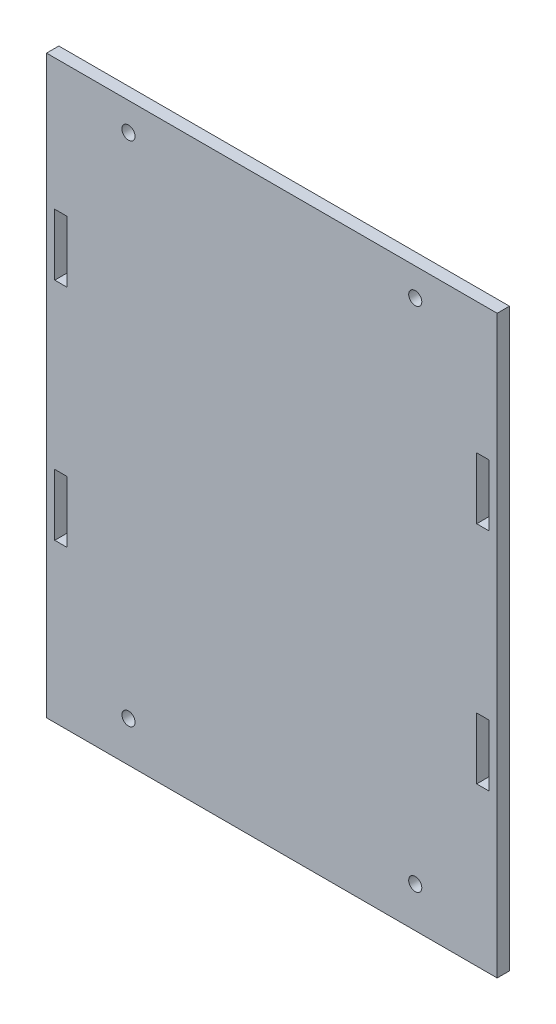
ISO-10303-21;
HEADER;
FILE_DESCRIPTION(('STEP AP214'),'2;1');
FILE_NAME('part.step','',(''),(''),'','','');
FILE_SCHEMA(('AUTOMOTIVE_DESIGN { 1 0 10303 214 1 1 1 1 }'));
ENDSEC;
DATA;
#1=APPLICATION_CONTEXT('core data for automotive mechanical design processes');
#2=APPLICATION_PROTOCOL_DEFINITION('international standard','automotive_design',2000,#1);
#3=PRODUCT_CONTEXT('',#1,'mechanical');
#4=PRODUCT('Part','Part','',(#3));
#5=PRODUCT_RELATED_PRODUCT_CATEGORY('part','',(#4));
#6=PRODUCT_DEFINITION_FORMATION('','',#4);
#7=PRODUCT_DEFINITION_CONTEXT('part definition',#1,'design');
#8=PRODUCT_DEFINITION('design','',#6,#7);
#9=PRODUCT_DEFINITION_SHAPE('','',#8);
#10=(LENGTH_UNIT() NAMED_UNIT(*) SI_UNIT(.MILLI.,.METRE.));
#11=(NAMED_UNIT(*) PLANE_ANGLE_UNIT() SI_UNIT($,.RADIAN.));
#12=(NAMED_UNIT(*) SI_UNIT($,.STERADIAN.) SOLID_ANGLE_UNIT());
#13=UNCERTAINTY_MEASURE_WITH_UNIT(LENGTH_MEASURE(1.E-05),#10,'distance_accuracy_value','');
#14=(GEOMETRIC_REPRESENTATION_CONTEXT(3) GLOBAL_UNCERTAINTY_ASSIGNED_CONTEXT((#13)) GLOBAL_UNIT_ASSIGNED_CONTEXT((#10,
#11,#12)) REPRESENTATION_CONTEXT('',''));
#15=CARTESIAN_POINT('',(0.,0.,0.));
#16=DIRECTION('',(0.,0.,1.));
#17=DIRECTION('',(1.,0.,0.));
#18=AXIS2_PLACEMENT_3D('',#15,#16,#17);
#19=CARTESIAN_POINT('',(50.,124.666666666667,-3.));
#20=DIRECTION('',(1.,0.,0.));
#21=DIRECTION('',(0.,1.,0.));
#22=AXIS2_PLACEMENT_3D('',#19,#20,#21);
#23=PLANE('',#22);
#24=DIRECTION('',(0.,0.,1.));
#25=VECTOR('',#24,1.);
#26=CARTESIAN_POINT('',(50.,92.6666666666667,-143.622252071917));
#27=LINE('',#26,#25);
#28=CARTESIAN_POINT('',(50.,92.6666666666667,-3.));
#29=VERTEX_POINT('',#28);
#30=CARTESIAN_POINT('',(50.,92.6666666666667,0.));
#31=VERTEX_POINT('',#30);
#32=EDGE_CURVE('E212',#29,#31,#27,.T.);
#33=ORIENTED_EDGE('',*,*,#32,.T.);
#34=DIRECTION('',(0.,1.,0.));
#35=VECTOR('',#34,1.);
#36=CARTESIAN_POINT('',(50.,124.666666666667,0.));
#37=LINE('',#36,#35);
#38=CARTESIAN_POINT('',(50.,77.6666666666667,0.));
#39=VERTEX_POINT('',#38);
#40=EDGE_CURVE('E333',#39,#31,#37,.T.);
#41=ORIENTED_EDGE('',*,*,#40,.F.);
#42=DIRECTION('',(0.,0.,1.));
#43=VECTOR('',#42,1.);
#44=CARTESIAN_POINT('',(50.,77.6666666666667,-143.622252071917));
#45=LINE('',#44,#43);
#46=CARTESIAN_POINT('',(50.,77.6666666666667,-3.));
#47=VERTEX_POINT('',#46);
#48=EDGE_CURVE('E223',#47,#39,#45,.T.);
#49=ORIENTED_EDGE('',*,*,#48,.F.);
#50=DIRECTION('',(0.,1.,0.));
#51=VECTOR('',#50,1.);
#52=CARTESIAN_POINT('',(50.,124.666666666667,-3.));
#53=LINE('',#52,#51);
#54=EDGE_CURVE('E336',#47,#29,#53,.T.);
#55=ORIENTED_EDGE('',*,*,#54,.T.);
#56=EDGE_LOOP('',(#33,#41,#49,#55));
#57=FACE_BOUND('',#56,.T.);
#58=ADVANCED_FACE('F37',(#57),#23,.T.);
#59=CARTESIAN_POINT('',(-50.,-15.8666666666667,-3.));
#60=DIRECTION('',(-1.,0.,0.));
#61=DIRECTION('',(0.,-1.,0.));
#62=AXIS2_PLACEMENT_3D('',#59,#60,#61);
#63=PLANE('',#62);
#64=DIRECTION('',(0.,-1.,0.));
#65=VECTOR('',#64,1.);
#66=CARTESIAN_POINT('',(-50.,-15.8666666666667,-3.));
#67=LINE('',#66,#65);
#68=CARTESIAN_POINT('',(-50.,37.6666666666667,-3.));
#69=VERTEX_POINT('',#68);
#70=CARTESIAN_POINT('',(-50.,22.6666666666667,-3.));
#71=VERTEX_POINT('',#70);
#72=EDGE_CURVE('E342',#69,#71,#67,.T.);
#73=ORIENTED_EDGE('',*,*,#72,.T.);
#74=DIRECTION('',(0.,0.,1.));
#75=VECTOR('',#74,1.);
#76=CARTESIAN_POINT('',(-50.,22.6666666666667,-143.622252071917));
#77=LINE('',#76,#75);
#78=CARTESIAN_POINT('',(-50.,22.6666666666667,0.));
#79=VERTEX_POINT('',#78);
#80=EDGE_CURVE('E272',#71,#79,#77,.T.);
#81=ORIENTED_EDGE('',*,*,#80,.T.);
#82=DIRECTION('',(0.,-1.,0.));
#83=VECTOR('',#82,1.);
#84=CARTESIAN_POINT('',(-50.,-15.8666666666667,0.));
#85=LINE('',#84,#83);
#86=CARTESIAN_POINT('',(-50.,37.6666666666667,0.));
#87=VERTEX_POINT('',#86);
#88=EDGE_CURVE('E348',#87,#79,#85,.T.);
#89=ORIENTED_EDGE('',*,*,#88,.F.);
#90=DIRECTION('',(0.,0.,1.));
#91=VECTOR('',#90,1.);
#92=CARTESIAN_POINT('',(-50.,37.6666666666667,-143.622252071917));
#93=LINE('',#92,#91);
#94=EDGE_CURVE('E267',#69,#87,#93,.T.);
#95=ORIENTED_EDGE('',*,*,#94,.F.);
#96=EDGE_LOOP('',(#73,#81,#89,#95));
#97=FACE_BOUND('',#96,.T.);
#98=ADVANCED_FACE('F398',(#97),#63,.T.);
#99=CARTESIAN_POINT('',(-50.,92.6666666666667,0.));
#100=VERTEX_POINT('',#99);
#101=CARTESIAN_POINT('',(-50.,77.6666666666667,0.));
#102=VERTEX_POINT('',#101);
#103=EDGE_CURVE('E350',#100,#102,#85,.T.);
#104=ORIENTED_EDGE('',*,*,#103,.F.);
#105=DIRECTION('',(0.,0.,1.));
#106=VECTOR('',#105,1.);
#107=CARTESIAN_POINT('',(-50.,92.6666666666667,-143.622252071917));
#108=LINE('',#107,#106);
#109=CARTESIAN_POINT('',(-50.,92.6666666666667,-3.));
#110=VERTEX_POINT('',#109);
#111=EDGE_CURVE('E255',#110,#100,#108,.T.);
#112=ORIENTED_EDGE('',*,*,#111,.F.);
#113=CARTESIAN_POINT('',(-50.,77.6666666666667,-3.));
#114=VERTEX_POINT('',#113);
#115=EDGE_CURVE('E46',#110,#114,#67,.T.);
#116=ORIENTED_EDGE('',*,*,#115,.T.);
#117=DIRECTION('',(0.,0.,1.));
#118=VECTOR('',#117,1.);
#119=CARTESIAN_POINT('',(-50.,77.6666666666667,-143.622252071917));
#120=LINE('',#119,#118);
#121=EDGE_CURVE('E262',#114,#102,#120,.T.);
#122=ORIENTED_EDGE('',*,*,#121,.T.);
#123=EDGE_LOOP('',(#104,#112,#116,#122));
#124=FACE_BOUND('',#123,.T.);
#125=ADVANCED_FACE('F420',(#124),#63,.T.);
#126=DIRECTION('',(0.,0.,1.));
#127=VECTOR('',#126,1.);
#128=CARTESIAN_POINT('',(50.,37.6666666666667,-143.622252071917));
#129=LINE('',#128,#127);
#130=CARTESIAN_POINT('',(50.,37.6666666666667,-3.));
#131=VERTEX_POINT('',#130);
#132=CARTESIAN_POINT('',(50.,37.6666666666667,0.));
#133=VERTEX_POINT('',#132);
#134=EDGE_CURVE('E220',#131,#133,#129,.T.);
#135=ORIENTED_EDGE('',*,*,#134,.T.);
#136=CARTESIAN_POINT('',(50.,22.6666666666667,0.));
#137=VERTEX_POINT('',#136);
#138=EDGE_CURVE('E346',#137,#133,#37,.T.);
#139=ORIENTED_EDGE('',*,*,#138,.F.);
#140=DIRECTION('',(0.,0.,1.));
#141=VECTOR('',#140,1.);
#142=CARTESIAN_POINT('',(50.,22.6666666666667,-143.622252071917));
#143=LINE('',#142,#141);
#144=CARTESIAN_POINT('',(50.,22.6666666666667,-3.));
#145=VERTEX_POINT('',#144);
#146=EDGE_CURVE('E190',#145,#137,#143,.T.);
#147=ORIENTED_EDGE('',*,*,#146,.F.);
#148=EDGE_CURVE('E339',#145,#131,#53,.T.);
#149=ORIENTED_EDGE('',*,*,#148,.T.);
#150=EDGE_LOOP('',(#135,#139,#147,#149));
#151=FACE_BOUND('',#150,.T.);
#152=ADVANCED_FACE('F39',(#151),#23,.T.);
#153=CARTESIAN_POINT('',(50.,-15.8666666666667,-3.));
#154=DIRECTION('',(0.,-1.,0.));
#155=DIRECTION('',(1.,0.,0.));
#156=AXIS2_PLACEMENT_3D('',#153,#154,#155);
#157=PLANE('',#156);
#158=DIRECTION('',(1.,0.,0.));
#159=VECTOR('',#158,1.);
#160=CARTESIAN_POINT('',(50.,-15.8666666666667,0.));
#161=LINE('',#160,#159);
#162=CARTESIAN_POINT('',(-55.,-15.8666666666667,0.));
#163=VERTEX_POINT('',#162);
#164=CARTESIAN_POINT('',(55.,-15.8666666666667,0.));
#165=VERTEX_POINT('',#164);
#166=EDGE_CURVE('E41',#163,#165,#161,.T.);
#167=ORIENTED_EDGE('',*,*,#166,.F.);
#168=DIRECTION('',(0.,0.,1.));
#169=VECTOR('',#168,1.);
#170=CARTESIAN_POINT('',(-55.,-15.8666666666667,-143.622252071917));
#171=LINE('',#170,#169);
#172=CARTESIAN_POINT('',(-55.,-15.8666666666667,-3.));
#173=VERTEX_POINT('',#172);
#174=EDGE_CURVE('E290',#173,#163,#171,.T.);
#175=ORIENTED_EDGE('',*,*,#174,.F.);
#176=DIRECTION('',(1.,0.,0.));
#177=VECTOR('',#176,1.);
#178=CARTESIAN_POINT('',(50.,-15.8666666666667,-3.));
#179=LINE('',#178,#177);
#180=CARTESIAN_POINT('',(55.,-15.8666666666667,-3.));
#181=VERTEX_POINT('',#180);
#182=EDGE_CURVE('E11',#173,#181,#179,.T.);
#183=ORIENTED_EDGE('',*,*,#182,.T.);
#184=DIRECTION('',(0.,0.,1.));
#185=VECTOR('',#184,1.);
#186=CARTESIAN_POINT('',(55.,-15.8666666666667,-143.622252071917));
#187=LINE('',#186,#185);
#188=EDGE_CURVE('E198',#181,#165,#187,.T.);
#189=ORIENTED_EDGE('',*,*,#188,.T.);
#190=EDGE_LOOP('',(#167,#175,#183,#189));
#191=FACE_BOUND('',#190,.T.);
#192=ADVANCED_FACE('F364',(#191),#157,.T.);
#193=CARTESIAN_POINT('',(50.,124.666666666667,-3.));
#194=DIRECTION('',(0.,1.,0.));
#195=DIRECTION('',(-1.,0.,0.));
#196=AXIS2_PLACEMENT_3D('',#193,#194,#195);
#197=PLANE('',#196);
#198=DIRECTION('',(-1.,0.,0.));
#199=VECTOR('',#198,1.);
#200=CARTESIAN_POINT('',(50.,124.666666666667,0.));
#201=LINE('',#200,#199);
#202=CARTESIAN_POINT('',(55.,124.666666666667,0.));
#203=VERTEX_POINT('',#202);
#204=CARTESIAN_POINT('',(-55.,124.666666666667,0.));
#205=VERTEX_POINT('',#204);
#206=EDGE_CURVE('E347',#203,#205,#201,.T.);
#207=ORIENTED_EDGE('',*,*,#206,.F.);
#208=DIRECTION('',(0.,0.,1.));
#209=VECTOR('',#208,1.);
#210=CARTESIAN_POINT('',(55.,124.666666666667,-143.622252071917));
#211=LINE('',#210,#209);
#212=CARTESIAN_POINT('',(55.,124.666666666667,-3.));
#213=VERTEX_POINT('',#212);
#214=EDGE_CURVE('E201',#213,#203,#211,.T.);
#215=ORIENTED_EDGE('',*,*,#214,.F.);
#216=DIRECTION('',(-1.,0.,0.));
#217=VECTOR('',#216,1.);
#218=CARTESIAN_POINT('',(50.,124.666666666667,-3.));
#219=LINE('',#218,#217);
#220=CARTESIAN_POINT('',(-55.,124.666666666667,-3.));
#221=VERTEX_POINT('',#220);
#222=EDGE_CURVE('E340',#213,#221,#219,.T.);
#223=ORIENTED_EDGE('',*,*,#222,.T.);
#224=DIRECTION('',(0.,0.,1.));
#225=VECTOR('',#224,1.);
#226=CARTESIAN_POINT('',(-55.,124.666666666667,-143.622252071917));
#227=LINE('',#226,#225);
#228=EDGE_CURVE('E299',#221,#205,#227,.T.);
#229=ORIENTED_EDGE('',*,*,#228,.T.);
#230=EDGE_LOOP('',(#207,#215,#223,#229));
#231=FACE_BOUND('',#230,.T.);
#232=ADVANCED_FACE('F370',(#231),#197,.T.);
#233=CARTESIAN_POINT('',(0.,0.,-3.));
#234=DIRECTION('',(0.,0.,-1.));
#235=DIRECTION('',(-1.,0.,0.));
#236=AXIS2_PLACEMENT_3D('',#233,#234,#235);
#237=PLANE('',#236);
#238=ORIENTED_EDGE('',*,*,#148,.F.);
#239=DIRECTION('',(-1.,0.,0.));
#240=VECTOR('',#239,1.);
#241=CARTESIAN_POINT('',(0.,22.6666666666667,-3.));
#242=LINE('',#241,#240);
#243=CARTESIAN_POINT('',(53.,22.6666666666667,-3.));
#244=VERTEX_POINT('',#243);
#245=EDGE_CURVE('E186',#244,#145,#242,.T.);
#246=ORIENTED_EDGE('',*,*,#245,.F.);
#247=DIRECTION('',(0.,-1.,0.));
#248=VECTOR('',#247,1.);
#249=CARTESIAN_POINT('',(53.,0.,-3.));
#250=LINE('',#249,#248);
#251=CARTESIAN_POINT('',(53.,37.6666666666667,-3.));
#252=VERTEX_POINT('',#251);
#253=EDGE_CURVE('E184',#252,#244,#250,.T.);
#254=ORIENTED_EDGE('',*,*,#253,.F.);
#255=DIRECTION('',(1.,0.,0.));
#256=VECTOR('',#255,1.);
#257=CARTESIAN_POINT('',(0.,37.6666666666667,-3.));
#258=LINE('',#257,#256);
#259=EDGE_CURVE('E217',#131,#252,#258,.T.);
#260=ORIENTED_EDGE('',*,*,#259,.F.);
#261=EDGE_LOOP('',(#238,#246,#254,#260));
#262=FACE_BOUND('',#261,.T.);
#263=DIRECTION('',(1.,0.,0.));
#264=VECTOR('',#263,1.);
#265=CARTESIAN_POINT('',(0.,92.6666666666667,-3.));
#266=LINE('',#265,#264);
#267=CARTESIAN_POINT('',(53.,92.6666666666667,-3.));
#268=VERTEX_POINT('',#267);
#269=EDGE_CURVE('E229',#29,#268,#266,.T.);
#270=ORIENTED_EDGE('',*,*,#269,.F.);
#271=ORIENTED_EDGE('',*,*,#54,.F.);
#272=DIRECTION('',(-1.,0.,0.));
#273=VECTOR('',#272,1.);
#274=CARTESIAN_POINT('',(0.,77.6666666666667,-3.));
#275=LINE('',#274,#273);
#276=CARTESIAN_POINT('',(53.,77.6666666666667,-3.));
#277=VERTEX_POINT('',#276);
#278=EDGE_CURVE('E221',#277,#47,#275,.T.);
#279=ORIENTED_EDGE('',*,*,#278,.F.);
#280=DIRECTION('',(0.,-1.,0.));
#281=VECTOR('',#280,1.);
#282=CARTESIAN_POINT('',(53.,0.,-3.));
#283=LINE('',#282,#281);
#284=EDGE_CURVE('E225',#268,#277,#283,.T.);
#285=ORIENTED_EDGE('',*,*,#284,.F.);
#286=EDGE_LOOP('',(#270,#271,#279,#285));
#287=FACE_BOUND('',#286,.T.);
#288=ORIENTED_EDGE('',*,*,#182,.F.);
#289=DIRECTION('',(0.,-1.,0.));
#290=VECTOR('',#289,1.);
#291=CARTESIAN_POINT('',(-55.,0.,-3.));
#292=LINE('',#291,#290);
#293=EDGE_CURVE('E287',#221,#173,#292,.T.);
#294=ORIENTED_EDGE('',*,*,#293,.F.);
#295=ORIENTED_EDGE('',*,*,#222,.F.);
#296=DIRECTION('',(0.,-1.,0.));
#297=VECTOR('',#296,1.);
#298=CARTESIAN_POINT('',(55.,0.,-3.));
#299=LINE('',#298,#297);
#300=EDGE_CURVE('E193',#213,#181,#299,.T.);
#301=ORIENTED_EDGE('',*,*,#300,.T.);
#302=EDGE_LOOP('',(#288,#294,#295,#301));
#303=FACE_BOUND('',#302,.T.);
#304=ORIENTED_EDGE('',*,*,#115,.F.);
#305=DIRECTION('',(-1.,0.,0.));
#306=VECTOR('',#305,1.);
#307=CARTESIAN_POINT('',(0.,92.6666666666667,-3.));
#308=LINE('',#307,#306);
#309=CARTESIAN_POINT('',(-53.,92.6666666666667,-3.));
#310=VERTEX_POINT('',#309);
#311=EDGE_CURVE('E283',#110,#310,#308,.T.);
#312=ORIENTED_EDGE('',*,*,#311,.T.);
#313=DIRECTION('',(0.,-1.,0.));
#314=VECTOR('',#313,1.);
#315=CARTESIAN_POINT('',(-53.,0.,-3.));
#316=LINE('',#315,#314);
#317=CARTESIAN_POINT('',(-53.,77.6666666666667,-3.));
#318=VERTEX_POINT('',#317);
#319=EDGE_CURVE('E280',#310,#318,#316,.T.);
#320=ORIENTED_EDGE('',*,*,#319,.T.);
#321=DIRECTION('',(1.,0.,0.));
#322=VECTOR('',#321,1.);
#323=CARTESIAN_POINT('',(0.,77.6666666666667,-3.));
#324=LINE('',#323,#322);
#325=EDGE_CURVE('E277',#318,#114,#324,.T.);
#326=ORIENTED_EDGE('',*,*,#325,.T.);
#327=EDGE_LOOP('',(#304,#312,#320,#326));
#328=FACE_BOUND('',#327,.T.);
#329=CARTESIAN_POINT('',(35.,117.866666666667,-3.));
#330=DIRECTION('',(0.,0.,1.));
#331=DIRECTION('',(1.,0.,0.));
#332=AXIS2_PLACEMENT_3D('',#329,#330,#331);
#333=CIRCLE('',#332,1.6);
#334=CARTESIAN_POINT('',(36.6,117.866666666667,-3.));
#335=VERTEX_POINT('',#334);
#336=EDGE_CURVE('E312',#335,#335,#333,.T.);
#337=ORIENTED_EDGE('',*,*,#336,.T.);
#338=EDGE_LOOP('',(#337));
#339=FACE_BOUND('',#338,.T.);
#340=CARTESIAN_POINT('',(-35.,117.866666666667,-3.));
#341=DIRECTION('',(0.,0.,1.));
#342=DIRECTION('',(1.,0.,0.));
#343=AXIS2_PLACEMENT_3D('',#340,#341,#342);
#344=CIRCLE('',#343,1.6);
#345=CARTESIAN_POINT('',(-33.4,117.866666666667,-3.));
#346=VERTEX_POINT('',#345);
#347=EDGE_CURVE('E318',#346,#346,#344,.T.);
#348=ORIENTED_EDGE('',*,*,#347,.T.);
#349=EDGE_LOOP('',(#348));
#350=FACE_BOUND('',#349,.T.);
#351=CARTESIAN_POINT('',(35.,-6.,-3.));
#352=DIRECTION('',(0.,0.,1.));
#353=DIRECTION('',(1.,0.,0.));
#354=AXIS2_PLACEMENT_3D('',#351,#352,#353);
#355=CIRCLE('',#354,1.6);
#356=CARTESIAN_POINT('',(36.6,-6.,-3.));
#357=VERTEX_POINT('',#356);
#358=EDGE_CURVE('E324',#357,#357,#355,.T.);
#359=ORIENTED_EDGE('',*,*,#358,.T.);
#360=EDGE_LOOP('',(#359));
#361=FACE_BOUND('',#360,.T.);
#362=CARTESIAN_POINT('',(-35.,-6.,-3.));
#363=DIRECTION('',(0.,0.,1.));
#364=DIRECTION('',(1.,0.,0.));
#365=AXIS2_PLACEMENT_3D('',#362,#363,#364);
#366=CIRCLE('',#365,1.6);
#367=CARTESIAN_POINT('',(-33.4,-6.,-3.));
#368=VERTEX_POINT('',#367);
#369=EDGE_CURVE('E330',#368,#368,#366,.T.);
#370=ORIENTED_EDGE('',*,*,#369,.T.);
#371=EDGE_LOOP('',(#370));
#372=FACE_BOUND('',#371,.T.);
#373=DIRECTION('',(1.,0.,0.));
#374=VECTOR('',#373,1.);
#375=CARTESIAN_POINT('',(0.,22.6666666666667,-3.));
#376=LINE('',#375,#374);
#377=CARTESIAN_POINT('',(-53.,22.6666666666667,-3.));
#378=VERTEX_POINT('',#377);
#379=EDGE_CURVE('E286',#378,#71,#376,.T.);
#380=ORIENTED_EDGE('',*,*,#379,.T.);
#381=ORIENTED_EDGE('',*,*,#72,.F.);
#382=DIRECTION('',(-1.,0.,0.));
#383=VECTOR('',#382,1.);
#384=CARTESIAN_POINT('',(0.,37.6666666666667,-3.));
#385=LINE('',#384,#383);
#386=CARTESIAN_POINT('',(-53.,37.6666666666667,-3.));
#387=VERTEX_POINT('',#386);
#388=EDGE_CURVE('E273',#69,#387,#385,.T.);
#389=ORIENTED_EDGE('',*,*,#388,.T.);
#390=DIRECTION('',(0.,-1.,0.));
#391=VECTOR('',#390,1.);
#392=CARTESIAN_POINT('',(-53.,0.,-3.));
#393=LINE('',#392,#391);
#394=EDGE_CURVE('E249',#387,#378,#393,.T.);
#395=ORIENTED_EDGE('',*,*,#394,.T.);
#396=EDGE_LOOP('',(#380,#381,#389,#395));
#397=FACE_BOUND('',#396,.T.);
#398=ADVANCED_FACE('F376',(#262,#287,#303,#328,#339,#350,#361,#372,#397),#237,.T.);
#399=CARTESIAN_POINT('',(0.,0.,0.));
#400=DIRECTION('',(0.,0.,-1.));
#401=DIRECTION('',(-1.,0.,0.));
#402=AXIS2_PLACEMENT_3D('',#399,#400,#401);
#403=PLANE('',#402);
#404=DIRECTION('',(-1.,0.,0.));
#405=VECTOR('',#404,1.);
#406=CARTESIAN_POINT('',(0.,22.6666666666667,0.));
#407=LINE('',#406,#405);
#408=CARTESIAN_POINT('',(53.,22.6666666666667,0.));
#409=VERTEX_POINT('',#408);
#410=EDGE_CURVE('E62',#409,#137,#407,.T.);
#411=ORIENTED_EDGE('',*,*,#410,.T.);
#412=ORIENTED_EDGE('',*,*,#138,.T.);
#413=DIRECTION('',(1.,0.,0.));
#414=VECTOR('',#413,1.);
#415=CARTESIAN_POINT('',(0.,37.6666666666667,0.));
#416=LINE('',#415,#414);
#417=CARTESIAN_POINT('',(53.,37.6666666666667,0.));
#418=VERTEX_POINT('',#417);
#419=EDGE_CURVE('E197',#133,#418,#416,.T.);
#420=ORIENTED_EDGE('',*,*,#419,.T.);
#421=DIRECTION('',(0.,-1.,0.));
#422=VECTOR('',#421,1.);
#423=CARTESIAN_POINT('',(53.,0.,0.));
#424=LINE('',#423,#422);
#425=EDGE_CURVE('E183',#418,#409,#424,.T.);
#426=ORIENTED_EDGE('',*,*,#425,.T.);
#427=EDGE_LOOP('',(#411,#412,#420,#426));
#428=FACE_BOUND('',#427,.T.);
#429=ORIENTED_EDGE('',*,*,#40,.T.);
#430=DIRECTION('',(1.,0.,0.));
#431=VECTOR('',#430,1.);
#432=CARTESIAN_POINT('',(0.,92.6666666666667,0.));
#433=LINE('',#432,#431);
#434=CARTESIAN_POINT('',(53.,92.6666666666667,0.));
#435=VERTEX_POINT('',#434);
#436=EDGE_CURVE('E192',#31,#435,#433,.T.);
#437=ORIENTED_EDGE('',*,*,#436,.T.);
#438=DIRECTION('',(0.,-1.,0.));
#439=VECTOR('',#438,1.);
#440=CARTESIAN_POINT('',(53.,0.,0.));
#441=LINE('',#440,#439);
#442=CARTESIAN_POINT('',(53.,77.6666666666667,0.));
#443=VERTEX_POINT('',#442);
#444=EDGE_CURVE('E206',#435,#443,#441,.T.);
#445=ORIENTED_EDGE('',*,*,#444,.T.);
#446=DIRECTION('',(-1.,0.,0.));
#447=VECTOR('',#446,1.);
#448=CARTESIAN_POINT('',(0.,77.6666666666667,0.));
#449=LINE('',#448,#447);
#450=EDGE_CURVE('E54',#443,#39,#449,.T.);
#451=ORIENTED_EDGE('',*,*,#450,.T.);
#452=EDGE_LOOP('',(#429,#437,#445,#451));
#453=FACE_BOUND('',#452,.T.);
#454=DIRECTION('',(0.,-1.,0.));
#455=VECTOR('',#454,1.);
#456=CARTESIAN_POINT('',(-55.,0.,0.));
#457=LINE('',#456,#455);
#458=EDGE_CURVE('E246',#205,#163,#457,.T.);
#459=ORIENTED_EDGE('',*,*,#458,.T.);
#460=ORIENTED_EDGE('',*,*,#166,.T.);
#461=DIRECTION('',(0.,-1.,0.));
#462=VECTOR('',#461,1.);
#463=CARTESIAN_POINT('',(55.,0.,0.));
#464=LINE('',#463,#462);
#465=EDGE_CURVE('E210',#203,#165,#464,.T.);
#466=ORIENTED_EDGE('',*,*,#465,.F.);
#467=ORIENTED_EDGE('',*,*,#206,.T.);
#468=EDGE_LOOP('',(#459,#460,#466,#467));
#469=FACE_BOUND('',#468,.T.);
#470=DIRECTION('',(-1.,0.,0.));
#471=VECTOR('',#470,1.);
#472=CARTESIAN_POINT('',(0.,92.6666666666667,0.));
#473=LINE('',#472,#471);
#474=CARTESIAN_POINT('',(-53.,92.6666666666667,0.));
#475=VERTEX_POINT('',#474);
#476=EDGE_CURVE('E251',#100,#475,#473,.T.);
#477=ORIENTED_EDGE('',*,*,#476,.F.);
#478=ORIENTED_EDGE('',*,*,#103,.T.);
#479=DIRECTION('',(1.,0.,0.));
#480=VECTOR('',#479,1.);
#481=CARTESIAN_POINT('',(0.,77.6666666666667,0.));
#482=LINE('',#481,#480);
#483=CARTESIAN_POINT('',(-53.,77.6666666666667,0.));
#484=VERTEX_POINT('',#483);
#485=EDGE_CURVE('E260',#484,#102,#482,.T.);
#486=ORIENTED_EDGE('',*,*,#485,.F.);
#487=DIRECTION('',(0.,-1.,0.));
#488=VECTOR('',#487,1.);
#489=CARTESIAN_POINT('',(-53.,0.,0.));
#490=LINE('',#489,#488);
#491=EDGE_CURVE('E256',#475,#484,#490,.T.);
#492=ORIENTED_EDGE('',*,*,#491,.F.);
#493=EDGE_LOOP('',(#477,#478,#486,#492));
#494=FACE_BOUND('',#493,.T.);
#495=CARTESIAN_POINT('',(35.,117.866666666667,0.));
#496=DIRECTION('',(0.,0.,1.));
#497=DIRECTION('',(1.,0.,0.));
#498=AXIS2_PLACEMENT_3D('',#495,#496,#497);
#499=CIRCLE('',#498,1.6);
#500=CARTESIAN_POINT('',(36.6,117.866666666667,0.));
#501=VERTEX_POINT('',#500);
#502=EDGE_CURVE('E276',#501,#501,#499,.T.);
#503=ORIENTED_EDGE('',*,*,#502,.F.);
#504=EDGE_LOOP('',(#503));
#505=FACE_BOUND('',#504,.T.);
#506=CARTESIAN_POINT('',(-35.,117.866666666667,0.));
#507=DIRECTION('',(0.,0.,1.));
#508=DIRECTION('',(1.,0.,0.));
#509=AXIS2_PLACEMENT_3D('',#506,#507,#508);
#510=CIRCLE('',#509,1.6);
#511=CARTESIAN_POINT('',(-33.4,117.866666666667,0.));
#512=VERTEX_POINT('',#511);
#513=EDGE_CURVE('E315',#512,#512,#510,.T.);
#514=ORIENTED_EDGE('',*,*,#513,.F.);
#515=EDGE_LOOP('',(#514));
#516=FACE_BOUND('',#515,.T.);
#517=CARTESIAN_POINT('',(35.,-6.,0.));
#518=DIRECTION('',(0.,0.,1.));
#519=DIRECTION('',(1.,0.,0.));
#520=AXIS2_PLACEMENT_3D('',#517,#518,#519);
#521=CIRCLE('',#520,1.6);
#522=CARTESIAN_POINT('',(36.6,-6.,0.));
#523=VERTEX_POINT('',#522);
#524=EDGE_CURVE('E321',#523,#523,#521,.T.);
#525=ORIENTED_EDGE('',*,*,#524,.F.);
#526=EDGE_LOOP('',(#525));
#527=FACE_BOUND('',#526,.T.);
#528=CARTESIAN_POINT('',(-35.,-6.,0.));
#529=DIRECTION('',(0.,0.,1.));
#530=DIRECTION('',(1.,0.,0.));
#531=AXIS2_PLACEMENT_3D('',#528,#529,#530);
#532=CIRCLE('',#531,1.6);
#533=CARTESIAN_POINT('',(-33.4,-6.,0.));
#534=VERTEX_POINT('',#533);
#535=EDGE_CURVE('E327',#534,#534,#532,.T.);
#536=ORIENTED_EDGE('',*,*,#535,.F.);
#537=EDGE_LOOP('',(#536));
#538=FACE_BOUND('',#537,.T.);
#539=ORIENTED_EDGE('',*,*,#88,.T.);
#540=DIRECTION('',(1.,0.,0.));
#541=VECTOR('',#540,1.);
#542=CARTESIAN_POINT('',(0.,22.6666666666667,0.));
#543=LINE('',#542,#541);
#544=CARTESIAN_POINT('',(-53.,22.6666666666667,0.));
#545=VERTEX_POINT('',#544);
#546=EDGE_CURVE('E270',#545,#79,#543,.T.);
#547=ORIENTED_EDGE('',*,*,#546,.F.);
#548=DIRECTION('',(0.,-1.,0.));
#549=VECTOR('',#548,1.);
#550=CARTESIAN_POINT('',(-53.,0.,0.));
#551=LINE('',#550,#549);
#552=CARTESIAN_POINT('',(-53.,37.6666666666667,0.));
#553=VERTEX_POINT('',#552);
#554=EDGE_CURVE('E250',#553,#545,#551,.T.);
#555=ORIENTED_EDGE('',*,*,#554,.F.);
#556=DIRECTION('',(-1.,0.,0.));
#557=VECTOR('',#556,1.);
#558=CARTESIAN_POINT('',(0.,37.6666666666667,0.));
#559=LINE('',#558,#557);
#560=EDGE_CURVE('E263',#87,#553,#559,.T.);
#561=ORIENTED_EDGE('',*,*,#560,.F.);
#562=EDGE_LOOP('',(#539,#547,#555,#561));
#563=FACE_BOUND('',#562,.T.);
#564=ADVANCED_FACE('F196',(#428,#453,#469,#494,#505,#516,#527,#538,#563),#403,.F.);
#565=CARTESIAN_POINT('',(-35.,-6.,-3.));
#566=DIRECTION('',(0.,0.,1.));
#567=DIRECTION('',(1.,0.,0.));
#568=AXIS2_PLACEMENT_3D('',#565,#566,#567);
#569=CYLINDRICAL_SURFACE('',#568,1.6);
#570=ORIENTED_EDGE('',*,*,#369,.F.);
#571=EDGE_LOOP('',(#570));
#572=FACE_BOUND('',#571,.T.);
#573=ORIENTED_EDGE('',*,*,#535,.T.);
#574=EDGE_LOOP('',(#573));
#575=FACE_BOUND('',#574,.T.);
#576=ADVANCED_FACE('F406',(#572,#575),#569,.F.);
#577=CARTESIAN_POINT('',(35.,-6.,-3.));
#578=DIRECTION('',(0.,0.,1.));
#579=DIRECTION('',(1.,0.,0.));
#580=AXIS2_PLACEMENT_3D('',#577,#578,#579);
#581=CYLINDRICAL_SURFACE('',#580,1.6);
#582=ORIENTED_EDGE('',*,*,#358,.F.);
#583=EDGE_LOOP('',(#582));
#584=FACE_BOUND('',#583,.T.);
#585=ORIENTED_EDGE('',*,*,#524,.T.);
#586=EDGE_LOOP('',(#585));
#587=FACE_BOUND('',#586,.T.);
#588=ADVANCED_FACE('F411',(#584,#587),#581,.F.);
#589=CARTESIAN_POINT('',(-35.,117.866666666667,-3.));
#590=DIRECTION('',(0.,0.,1.));
#591=DIRECTION('',(1.,0.,0.));
#592=AXIS2_PLACEMENT_3D('',#589,#590,#591);
#593=CYLINDRICAL_SURFACE('',#592,1.6);
#594=ORIENTED_EDGE('',*,*,#347,.F.);
#595=EDGE_LOOP('',(#594));
#596=FACE_BOUND('',#595,.T.);
#597=ORIENTED_EDGE('',*,*,#513,.T.);
#598=EDGE_LOOP('',(#597));
#599=FACE_BOUND('',#598,.T.);
#600=ADVANCED_FACE('F483',(#596,#599),#593,.F.);
#601=CARTESIAN_POINT('',(35.,117.866666666667,-3.));
#602=DIRECTION('',(0.,0.,1.));
#603=DIRECTION('',(1.,0.,0.));
#604=AXIS2_PLACEMENT_3D('',#601,#602,#603);
#605=CYLINDRICAL_SURFACE('',#604,1.6);
#606=ORIENTED_EDGE('',*,*,#336,.F.);
#607=EDGE_LOOP('',(#606));
#608=FACE_BOUND('',#607,.T.);
#609=ORIENTED_EDGE('',*,*,#502,.T.);
#610=EDGE_LOOP('',(#609));
#611=FACE_BOUND('',#610,.T.);
#612=ADVANCED_FACE('F480',(#608,#611),#605,.F.);
#613=CARTESIAN_POINT('',(0.,22.6666666666667,-143.622252071917));
#614=DIRECTION('',(0.,-1.,0.));
#615=DIRECTION('',(1.,0.,0.));
#616=AXIS2_PLACEMENT_3D('',#613,#614,#615);
#617=PLANE('',#616);
#618=ORIENTED_EDGE('',*,*,#379,.F.);
#619=DIRECTION('',(0.,0.,1.));
#620=VECTOR('',#619,1.);
#621=CARTESIAN_POINT('',(-53.,22.6666666666667,-143.622252071917));
#622=LINE('',#621,#620);
#623=EDGE_CURVE('E245',#378,#545,#622,.T.);
#624=ORIENTED_EDGE('',*,*,#623,.T.);
#625=ORIENTED_EDGE('',*,*,#546,.T.);
#626=ORIENTED_EDGE('',*,*,#80,.F.);
#627=EDGE_LOOP('',(#618,#624,#625,#626));
#628=FACE_BOUND('',#627,.T.);
#629=ADVANCED_FACE('F404',(#628),#617,.F.);
#630=CARTESIAN_POINT('',(-55.,0.,-143.622252071917));
#631=DIRECTION('',(-1.,0.,0.));
#632=DIRECTION('',(0.,-1.,0.));
#633=AXIS2_PLACEMENT_3D('',#630,#631,#632);
#634=PLANE('',#633);
#635=ORIENTED_EDGE('',*,*,#228,.F.);
#636=ORIENTED_EDGE('',*,*,#293,.T.);
#637=ORIENTED_EDGE('',*,*,#174,.T.);
#638=ORIENTED_EDGE('',*,*,#458,.F.);
#639=EDGE_LOOP('',(#635,#636,#637,#638));
#640=FACE_BOUND('',#639,.T.);
#641=ADVANCED_FACE('F374',(#640),#634,.T.);
#642=CARTESIAN_POINT('',(0.,92.6666666666667,-143.622252071917));
#643=DIRECTION('',(0.,1.,0.));
#644=DIRECTION('',(0.,0.,1.));
#645=AXIS2_PLACEMENT_3D('',#642,#643,#644);
#646=PLANE('',#645);
#647=ORIENTED_EDGE('',*,*,#311,.F.);
#648=ORIENTED_EDGE('',*,*,#111,.T.);
#649=ORIENTED_EDGE('',*,*,#476,.T.);
#650=DIRECTION('',(0.,0.,1.));
#651=VECTOR('',#650,1.);
#652=CARTESIAN_POINT('',(-53.,92.6666666666667,-143.622252071917));
#653=LINE('',#652,#651);
#654=EDGE_CURVE('E254',#310,#475,#653,.T.);
#655=ORIENTED_EDGE('',*,*,#654,.F.);
#656=EDGE_LOOP('',(#647,#648,#649,#655));
#657=FACE_BOUND('',#656,.T.);
#658=ADVANCED_FACE('F471',(#657),#646,.F.);
#659=CARTESIAN_POINT('',(-53.,0.,-143.622252071917));
#660=DIRECTION('',(-1.,0.,0.));
#661=DIRECTION('',(0.,0.,1.));
#662=AXIS2_PLACEMENT_3D('',#659,#660,#661);
#663=PLANE('',#662);
#664=ORIENTED_EDGE('',*,*,#319,.F.);
#665=ORIENTED_EDGE('',*,*,#654,.T.);
#666=ORIENTED_EDGE('',*,*,#491,.T.);
#667=DIRECTION('',(0.,0.,1.));
#668=VECTOR('',#667,1.);
#669=CARTESIAN_POINT('',(-53.,77.6666666666667,-143.622252071917));
#670=LINE('',#669,#668);
#671=EDGE_CURVE('E259',#318,#484,#670,.T.);
#672=ORIENTED_EDGE('',*,*,#671,.F.);
#673=EDGE_LOOP('',(#664,#665,#666,#672));
#674=FACE_BOUND('',#673,.T.);
#675=ADVANCED_FACE('F467',(#674),#663,.F.);
#676=CARTESIAN_POINT('',(0.,77.6666666666667,-143.622252071917));
#677=DIRECTION('',(0.,-1.,0.));
#678=DIRECTION('',(0.,0.,-1.));
#679=AXIS2_PLACEMENT_3D('',#676,#677,#678);
#680=PLANE('',#679);
#681=ORIENTED_EDGE('',*,*,#325,.F.);
#682=ORIENTED_EDGE('',*,*,#671,.T.);
#683=ORIENTED_EDGE('',*,*,#485,.T.);
#684=ORIENTED_EDGE('',*,*,#121,.F.);
#685=EDGE_LOOP('',(#681,#682,#683,#684));
#686=FACE_BOUND('',#685,.T.);
#687=ADVANCED_FACE('F464',(#686),#680,.F.);
#688=CARTESIAN_POINT('',(0.,37.6666666666667,-143.622252071917));
#689=DIRECTION('',(0.,1.,0.));
#690=DIRECTION('',(0.,0.,1.));
#691=AXIS2_PLACEMENT_3D('',#688,#689,#690);
#692=PLANE('',#691);
#693=ORIENTED_EDGE('',*,*,#388,.F.);
#694=ORIENTED_EDGE('',*,*,#94,.T.);
#695=ORIENTED_EDGE('',*,*,#560,.T.);
#696=DIRECTION('',(0.,0.,1.));
#697=VECTOR('',#696,1.);
#698=CARTESIAN_POINT('',(-53.,37.6666666666667,-143.622252071917));
#699=LINE('',#698,#697);
#700=EDGE_CURVE('E266',#387,#553,#699,.T.);
#701=ORIENTED_EDGE('',*,*,#700,.F.);
#702=EDGE_LOOP('',(#693,#694,#695,#701));
#703=FACE_BOUND('',#702,.T.);
#704=ADVANCED_FACE('F400',(#703),#692,.F.);
#705=CARTESIAN_POINT('',(-53.,0.,-143.622252071917));
#706=DIRECTION('',(-1.,0.,0.));
#707=DIRECTION('',(0.,0.,1.));
#708=AXIS2_PLACEMENT_3D('',#705,#706,#707);
#709=PLANE('',#708);
#710=ORIENTED_EDGE('',*,*,#394,.F.);
#711=ORIENTED_EDGE('',*,*,#700,.T.);
#712=ORIENTED_EDGE('',*,*,#554,.T.);
#713=ORIENTED_EDGE('',*,*,#623,.F.);
#714=EDGE_LOOP('',(#710,#711,#712,#713));
#715=FACE_BOUND('',#714,.T.);
#716=ADVANCED_FACE('F403',(#715),#709,.F.);
#717=CARTESIAN_POINT('',(55.,0.,-143.622252071917));
#718=DIRECTION('',(-1.,0.,0.));
#719=DIRECTION('',(0.,-1.,0.));
#720=AXIS2_PLACEMENT_3D('',#717,#718,#719);
#721=PLANE('',#720);
#722=ORIENTED_EDGE('',*,*,#300,.F.);
#723=ORIENTED_EDGE('',*,*,#214,.T.);
#724=ORIENTED_EDGE('',*,*,#465,.T.);
#725=ORIENTED_EDGE('',*,*,#188,.F.);
#726=EDGE_LOOP('',(#722,#723,#724,#725));
#727=FACE_BOUND('',#726,.T.);
#728=ADVANCED_FACE('F367',(#727),#721,.F.);
#729=CARTESIAN_POINT('',(0.,92.6666666666667,-143.622252071917));
#730=DIRECTION('',(0.,-1.,0.));
#731=DIRECTION('',(0.,0.,-1.));
#732=AXIS2_PLACEMENT_3D('',#729,#730,#731);
#733=PLANE('',#732);
#734=ORIENTED_EDGE('',*,*,#32,.F.);
#735=ORIENTED_EDGE('',*,*,#269,.T.);
#736=DIRECTION('',(0.,0.,1.));
#737=VECTOR('',#736,1.);
#738=CARTESIAN_POINT('',(53.,92.6666666666667,-143.622252071917));
#739=LINE('',#738,#737);
#740=EDGE_CURVE('E228',#268,#435,#739,.T.);
#741=ORIENTED_EDGE('',*,*,#740,.T.);
#742=ORIENTED_EDGE('',*,*,#436,.F.);
#743=EDGE_LOOP('',(#734,#735,#741,#742));
#744=FACE_BOUND('',#743,.T.);
#745=ADVANCED_FACE('F439',(#744),#733,.T.);
#746=CARTESIAN_POINT('',(53.,0.,-143.622252071917));
#747=DIRECTION('',(-1.,0.,0.));
#748=DIRECTION('',(0.,0.,1.));
#749=AXIS2_PLACEMENT_3D('',#746,#747,#748);
#750=PLANE('',#749);
#751=ORIENTED_EDGE('',*,*,#740,.F.);
#752=ORIENTED_EDGE('',*,*,#284,.T.);
#753=DIRECTION('',(0.,0.,1.));
#754=VECTOR('',#753,1.);
#755=CARTESIAN_POINT('',(53.,77.6666666666667,-143.622252071917));
#756=LINE('',#755,#754);
#757=EDGE_CURVE('E224',#277,#443,#756,.T.);
#758=ORIENTED_EDGE('',*,*,#757,.T.);
#759=ORIENTED_EDGE('',*,*,#444,.F.);
#760=EDGE_LOOP('',(#751,#752,#758,#759));
#761=FACE_BOUND('',#760,.T.);
#762=ADVANCED_FACE('F447',(#761),#750,.T.);
#763=CARTESIAN_POINT('',(0.,77.6666666666667,-143.622252071917));
#764=DIRECTION('',(0.,1.,0.));
#765=DIRECTION('',(0.,0.,1.));
#766=AXIS2_PLACEMENT_3D('',#763,#764,#765);
#767=PLANE('',#766);
#768=ORIENTED_EDGE('',*,*,#757,.F.);
#769=ORIENTED_EDGE('',*,*,#278,.T.);
#770=ORIENTED_EDGE('',*,*,#48,.T.);
#771=ORIENTED_EDGE('',*,*,#450,.F.);
#772=EDGE_LOOP('',(#768,#769,#770,#771));
#773=FACE_BOUND('',#772,.T.);
#774=ADVANCED_FACE('F444',(#773),#767,.T.);
#775=CARTESIAN_POINT('',(0.,37.6666666666667,-143.622252071917));
#776=DIRECTION('',(0.,-1.,0.));
#777=DIRECTION('',(0.,0.,-1.));
#778=AXIS2_PLACEMENT_3D('',#775,#776,#777);
#779=PLANE('',#778);
#780=ORIENTED_EDGE('',*,*,#134,.F.);
#781=ORIENTED_EDGE('',*,*,#259,.T.);
#782=DIRECTION('',(0.,0.,1.));
#783=VECTOR('',#782,1.);
#784=CARTESIAN_POINT('',(53.,37.6666666666667,-143.622252071917));
#785=LINE('',#784,#783);
#786=EDGE_CURVE('E216',#252,#418,#785,.T.);
#787=ORIENTED_EDGE('',*,*,#786,.T.);
#788=ORIENTED_EDGE('',*,*,#419,.F.);
#789=EDGE_LOOP('',(#780,#781,#787,#788));
#790=FACE_BOUND('',#789,.T.);
#791=ADVANCED_FACE('F433',(#790),#779,.T.);
#792=CARTESIAN_POINT('',(53.,0.,-143.622252071917));
#793=DIRECTION('',(-1.,0.,0.));
#794=DIRECTION('',(0.,0.,1.));
#795=AXIS2_PLACEMENT_3D('',#792,#793,#794);
#796=PLANE('',#795);
#797=ORIENTED_EDGE('',*,*,#786,.F.);
#798=ORIENTED_EDGE('',*,*,#253,.T.);
#799=DIRECTION('',(0.,0.,1.));
#800=VECTOR('',#799,1.);
#801=CARTESIAN_POINT('',(53.,22.6666666666667,-143.622252071917));
#802=LINE('',#801,#800);
#803=EDGE_CURVE('E180',#244,#409,#802,.T.);
#804=ORIENTED_EDGE('',*,*,#803,.T.);
#805=ORIENTED_EDGE('',*,*,#425,.F.);
#806=EDGE_LOOP('',(#797,#798,#804,#805));
#807=FACE_BOUND('',#806,.T.);
#808=ADVANCED_FACE('F182',(#807),#796,.T.);
#809=CARTESIAN_POINT('',(0.,22.6666666666667,-143.622252071917));
#810=DIRECTION('',(0.,1.,0.));
#811=DIRECTION('',(-1.,0.,0.));
#812=AXIS2_PLACEMENT_3D('',#809,#810,#811);
#813=PLANE('',#812);
#814=ORIENTED_EDGE('',*,*,#803,.F.);
#815=ORIENTED_EDGE('',*,*,#245,.T.);
#816=ORIENTED_EDGE('',*,*,#146,.T.);
#817=ORIENTED_EDGE('',*,*,#410,.F.);
#818=EDGE_LOOP('',(#814,#815,#816,#817));
#819=FACE_BOUND('',#818,.T.);
#820=ADVANCED_FACE('F188',(#819),#813,.T.);
#821=CLOSED_SHELL('',(#58,#98,#125,#152,#192,#232,#398,#564,#576,#588,#600,#612,#629,#641,#658,
#675,#687,#704,#716,#728,#745,#762,#774,#791,#808,#820));
#822=MANIFOLD_SOLID_BREP('B2',#821);
#823=ADVANCED_BREP_SHAPE_REPRESENTATION('',(#18,#822),#14);
#824=SHAPE_DEFINITION_REPRESENTATION(#9,#823);
ENDSEC;
END-ISO-10303-21;
